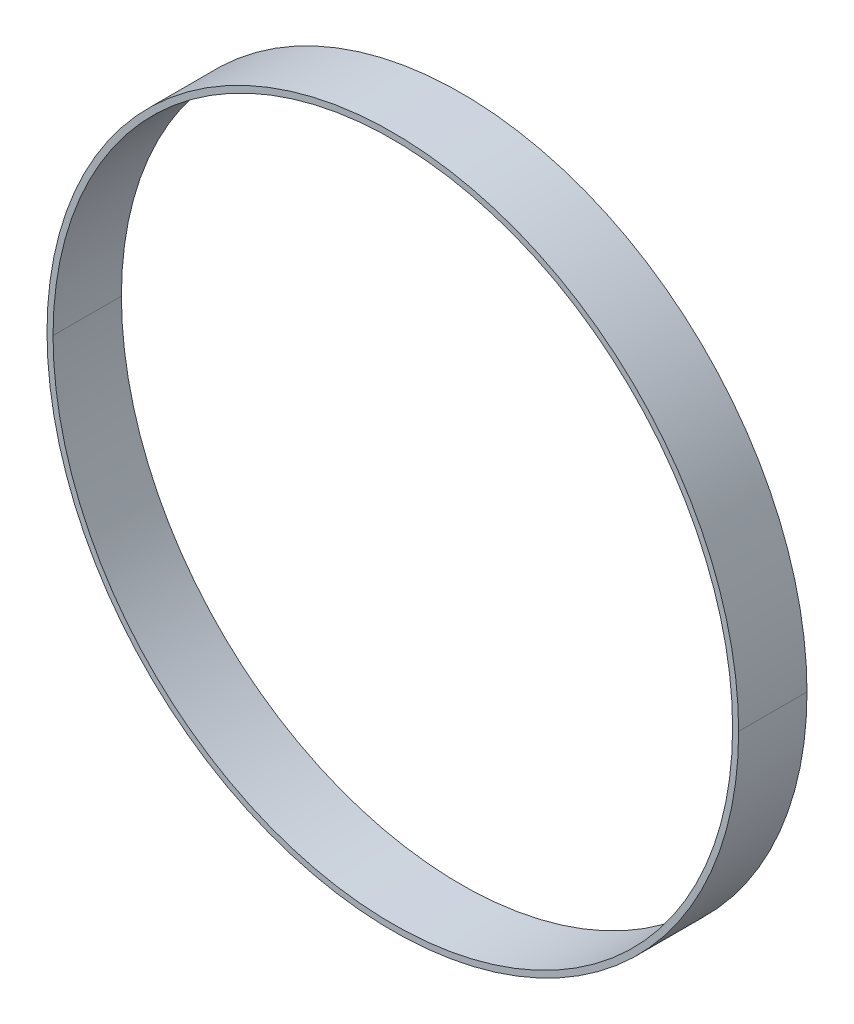
ISO-10303-21;
HEADER;
FILE_DESCRIPTION(('STEP AP214'),'2;1');
FILE_NAME('part.step','',(''),(''),'','','');
FILE_SCHEMA(('AUTOMOTIVE_DESIGN { 1 0 10303 214 1 1 1 1 }'));
ENDSEC;
DATA;
#1=APPLICATION_CONTEXT('core data for automotive mechanical design processes');
#2=APPLICATION_PROTOCOL_DEFINITION('international standard','automotive_design',2000,#1);
#3=PRODUCT_CONTEXT('',#1,'mechanical');
#4=PRODUCT('Part','Part','',(#3));
#5=PRODUCT_RELATED_PRODUCT_CATEGORY('part','',(#4));
#6=PRODUCT_DEFINITION_FORMATION('','',#4);
#7=PRODUCT_DEFINITION_CONTEXT('part definition',#1,'design');
#8=PRODUCT_DEFINITION('design','',#6,#7);
#9=PRODUCT_DEFINITION_SHAPE('','',#8);
#10=(LENGTH_UNIT() NAMED_UNIT(*) SI_UNIT(.MILLI.,.METRE.));
#11=(NAMED_UNIT(*) PLANE_ANGLE_UNIT() SI_UNIT($,.RADIAN.));
#12=(NAMED_UNIT(*) SI_UNIT($,.STERADIAN.) SOLID_ANGLE_UNIT());
#13=UNCERTAINTY_MEASURE_WITH_UNIT(LENGTH_MEASURE(1.E-05),#10,'distance_accuracy_value','');
#14=(GEOMETRIC_REPRESENTATION_CONTEXT(3) GLOBAL_UNCERTAINTY_ASSIGNED_CONTEXT((#13)) GLOBAL_UNIT_ASSIGNED_CONTEXT((#10,
#11,#12)) REPRESENTATION_CONTEXT('',''));
#15=CARTESIAN_POINT('',(0.,0.,0.));
#16=DIRECTION('',(0.,0.,1.));
#17=DIRECTION('',(1.,0.,0.));
#18=AXIS2_PLACEMENT_3D('',#15,#16,#17);
#19=CARTESIAN_POINT('',(-2.67782882710872E-13,2.77200885110634E-13,-58.5));
#20=DIRECTION('',(0.,0.,1.));
#21=DIRECTION('',(1.,0.,0.));
#22=AXIS2_PLACEMENT_3D('',#19,#20,#21);
#23=CYLINDRICAL_SURFACE('',#22,42.25);
#24=CARTESIAN_POINT('',(-2.67782882710872E-13,2.77200885110634E-13,-58.5));
#25=DIRECTION('',(0.,0.,-1.));
#26=DIRECTION('',(-1.,0.,0.));
#27=AXIS2_PLACEMENT_3D('',#24,#25,#26);
#28=CIRCLE('',#27,42.25);
#29=CARTESIAN_POINT('',(42.25,2.59854647994099E-13,-58.5));
#30=VERTEX_POINT('',#29);
#31=CARTESIAN_POINT('',(-42.25,2.99721254953571E-13,-58.5));
#32=VERTEX_POINT('',#31);
#33=EDGE_CURVE('E11',#30,#32,#28,.T.);
#34=ORIENTED_EDGE('',*,*,#33,.T.);
#35=DIRECTION('',(0.,0.,1.));
#36=VECTOR('',#35,1.);
#37=CARTESIAN_POINT('',(-42.25,2.99721254953569E-13,-58.5));
#38=LINE('',#37,#36);
#39=CARTESIAN_POINT('',(-42.25,2.99721254953571E-13,-50.));
#40=VERTEX_POINT('',#39);
#41=EDGE_CURVE('E26',#32,#40,#38,.T.);
#42=ORIENTED_EDGE('',*,*,#41,.T.);
#43=CARTESIAN_POINT('',(-2.67782882710872E-13,2.77200885110636E-13,-50.));
#44=DIRECTION('',(0.,0.,-1.));
#45=DIRECTION('',(-1.,0.,0.));
#46=AXIS2_PLACEMENT_3D('',#43,#44,#45);
#47=CIRCLE('',#46,42.25);
#48=CARTESIAN_POINT('',(42.25,2.59854647994099E-13,-50.));
#49=VERTEX_POINT('',#48);
#50=EDGE_CURVE('E50',#49,#40,#47,.T.);
#51=ORIENTED_EDGE('',*,*,#50,.F.);
#52=DIRECTION('',(0.,0.,1.));
#53=VECTOR('',#52,1.);
#54=CARTESIAN_POINT('',(42.25,2.59854647994098E-13,-58.5));
#55=LINE('',#54,#53);
#56=EDGE_CURVE('E63',#30,#49,#55,.T.);
#57=ORIENTED_EDGE('',*,*,#56,.F.);
#58=EDGE_LOOP('',(#34,#42,#51,#57));
#59=FACE_BOUND('',#58,.T.);
#60=ADVANCED_FACE('F16',(#59),#23,.F.);
#61=CARTESIAN_POINT('',(-2.67782882710872E-13,2.77200885110634E-13,-58.5));
#62=DIRECTION('',(0.,0.,1.));
#63=DIRECTION('',(1.,0.,0.));
#64=AXIS2_PLACEMENT_3D('',#61,#62,#63);
#65=CYLINDRICAL_SURFACE('',#64,43.);
#66=CARTESIAN_POINT('',(-2.67782882710872E-13,2.77200885110634E-13,-58.5));
#67=DIRECTION('',(0.,0.,-1.));
#68=DIRECTION('',(-1.,0.,0.));
#69=AXIS2_PLACEMENT_3D('',#66,#67,#68);
#70=CIRCLE('',#69,43.);
#71=CARTESIAN_POINT('',(-43.,3.0012102483244E-13,-58.5));
#72=VERTEX_POINT('',#71);
#73=CARTESIAN_POINT('',(43.,2.59546726625167E-13,-58.5));
#74=VERTEX_POINT('',#73);
#75=EDGE_CURVE('E76',#72,#74,#70,.T.);
#76=ORIENTED_EDGE('',*,*,#75,.F.);
#77=DIRECTION('',(0.,0.,1.));
#78=VECTOR('',#77,1.);
#79=CARTESIAN_POINT('',(-43.,3.00121024832438E-13,-58.5));
#80=LINE('',#79,#78);
#81=CARTESIAN_POINT('',(-43.,3.0012102483244E-13,-50.));
#82=VERTEX_POINT('',#81);
#83=EDGE_CURVE('E20',#72,#82,#80,.T.);
#84=ORIENTED_EDGE('',*,*,#83,.T.);
#85=CARTESIAN_POINT('',(-2.67782882710872E-13,2.77200885110636E-13,-50.));
#86=DIRECTION('',(0.,0.,-1.));
#87=DIRECTION('',(-1.,0.,0.));
#88=AXIS2_PLACEMENT_3D('',#85,#86,#87);
#89=CIRCLE('',#88,43.);
#90=CARTESIAN_POINT('',(43.,2.59546726625167E-13,-50.));
#91=VERTEX_POINT('',#90);
#92=EDGE_CURVE('E94',#82,#91,#89,.T.);
#93=ORIENTED_EDGE('',*,*,#92,.T.);
#94=DIRECTION('',(0.,0.,1.));
#95=VECTOR('',#94,1.);
#96=CARTESIAN_POINT('',(43.,2.59546726625165E-13,-58.5));
#97=LINE('',#96,#95);
#98=EDGE_CURVE('E89',#74,#91,#97,.T.);
#99=ORIENTED_EDGE('',*,*,#98,.F.);
#100=EDGE_LOOP('',(#76,#84,#93,#99));
#101=FACE_BOUND('',#100,.T.);
#102=ADVANCED_FACE('F93',(#101),#65,.T.);
#103=CARTESIAN_POINT('',(-2.67782882710872E-13,2.77200885110634E-13,-58.5));
#104=DIRECTION('',(0.,0.,-1.));
#105=DIRECTION('',(0.,-1.,0.));
#106=AXIS2_PLACEMENT_3D('',#103,#104,#105);
#107=PLANE('',#106);
#108=CARTESIAN_POINT('',(-2.67782882710872E-13,2.77200885110634E-13,-58.5));
#109=DIRECTION('',(0.,0.,-1.));
#110=DIRECTION('',(-1.,0.,0.));
#111=AXIS2_PLACEMENT_3D('',#108,#109,#110);
#112=CIRCLE('',#111,43.);
#113=EDGE_CURVE('E104',#74,#72,#112,.T.);
#114=ORIENTED_EDGE('',*,*,#113,.T.);
#115=ORIENTED_EDGE('',*,*,#75,.T.);
#116=EDGE_LOOP('',(#114,#115));
#117=FACE_BOUND('',#116,.T.);
#118=ORIENTED_EDGE('',*,*,#33,.F.);
#119=CARTESIAN_POINT('',(-2.67782882710872E-13,2.77200885110634E-13,-58.5));
#120=DIRECTION('',(0.,0.,-1.));
#121=DIRECTION('',(-1.,0.,0.));
#122=AXIS2_PLACEMENT_3D('',#119,#120,#121);
#123=CIRCLE('',#122,42.25);
#124=EDGE_CURVE('E116',#32,#30,#123,.T.);
#125=ORIENTED_EDGE('',*,*,#124,.F.);
#126=EDGE_LOOP('',(#118,#125));
#127=FACE_BOUND('',#126,.T.);
#128=ADVANCED_FACE('F102',(#117,#127),#107,.T.);
#129=CARTESIAN_POINT('',(-2.67782882710872E-13,2.77200885110636E-13,-50.));
#130=DIRECTION('',(0.,0.,-1.));
#131=DIRECTION('',(0.,-1.,0.));
#132=AXIS2_PLACEMENT_3D('',#129,#130,#131);
#133=PLANE('',#132);
#134=CARTESIAN_POINT('',(-2.67782882710872E-13,2.77200885110636E-13,-50.));
#135=DIRECTION('',(0.,0.,-1.));
#136=DIRECTION('',(-1.,0.,0.));
#137=AXIS2_PLACEMENT_3D('',#134,#135,#136);
#138=CIRCLE('',#137,43.);
#139=EDGE_CURVE('E98',#91,#82,#138,.T.);
#140=ORIENTED_EDGE('',*,*,#139,.F.);
#141=ORIENTED_EDGE('',*,*,#92,.F.);
#142=EDGE_LOOP('',(#140,#141));
#143=FACE_BOUND('',#142,.T.);
#144=ORIENTED_EDGE('',*,*,#50,.T.);
#145=CARTESIAN_POINT('',(-2.67782882710872E-13,2.77200885110636E-13,-50.));
#146=DIRECTION('',(0.,0.,-1.));
#147=DIRECTION('',(-1.,0.,0.));
#148=AXIS2_PLACEMENT_3D('',#145,#146,#147);
#149=CIRCLE('',#148,42.25);
#150=EDGE_CURVE('E97',#40,#49,#149,.T.);
#151=ORIENTED_EDGE('',*,*,#150,.T.);
#152=EDGE_LOOP('',(#144,#151));
#153=FACE_BOUND('',#152,.T.);
#154=ADVANCED_FACE('F172',(#143,#153),#133,.F.);
#155=CARTESIAN_POINT('',(-2.67782882710872E-13,2.77200885110634E-13,-58.5));
#156=DIRECTION('',(0.,0.,1.));
#157=DIRECTION('',(1.,0.,0.));
#158=AXIS2_PLACEMENT_3D('',#155,#156,#157);
#159=CYLINDRICAL_SURFACE('',#158,43.);
#160=ORIENTED_EDGE('',*,*,#83,.F.);
#161=ORIENTED_EDGE('',*,*,#113,.F.);
#162=ORIENTED_EDGE('',*,*,#98,.T.);
#163=ORIENTED_EDGE('',*,*,#139,.T.);
#164=EDGE_LOOP('',(#160,#161,#162,#163));
#165=FACE_BOUND('',#164,.T.);
#166=ADVANCED_FACE('F107',(#165),#159,.T.);
#167=CARTESIAN_POINT('',(-2.67782882710872E-13,2.77200885110634E-13,-58.5));
#168=DIRECTION('',(0.,0.,1.));
#169=DIRECTION('',(1.,0.,0.));
#170=AXIS2_PLACEMENT_3D('',#167,#168,#169);
#171=CYLINDRICAL_SURFACE('',#170,42.25);
#172=ORIENTED_EDGE('',*,*,#41,.F.);
#173=ORIENTED_EDGE('',*,*,#124,.T.);
#174=ORIENTED_EDGE('',*,*,#56,.T.);
#175=ORIENTED_EDGE('',*,*,#150,.F.);
#176=EDGE_LOOP('',(#172,#173,#174,#175));
#177=FACE_BOUND('',#176,.T.);
#178=ADVANCED_FACE('F18',(#177),#171,.F.);
#179=CLOSED_SHELL('',(#60,#102,#128,#154,#166,#178));
#180=MANIFOLD_SOLID_BREP('B1',#179);
#181=ADVANCED_BREP_SHAPE_REPRESENTATION('',(#18,#180),#14);
#182=SHAPE_DEFINITION_REPRESENTATION(#9,#181);
ENDSEC;
END-ISO-10303-21;
